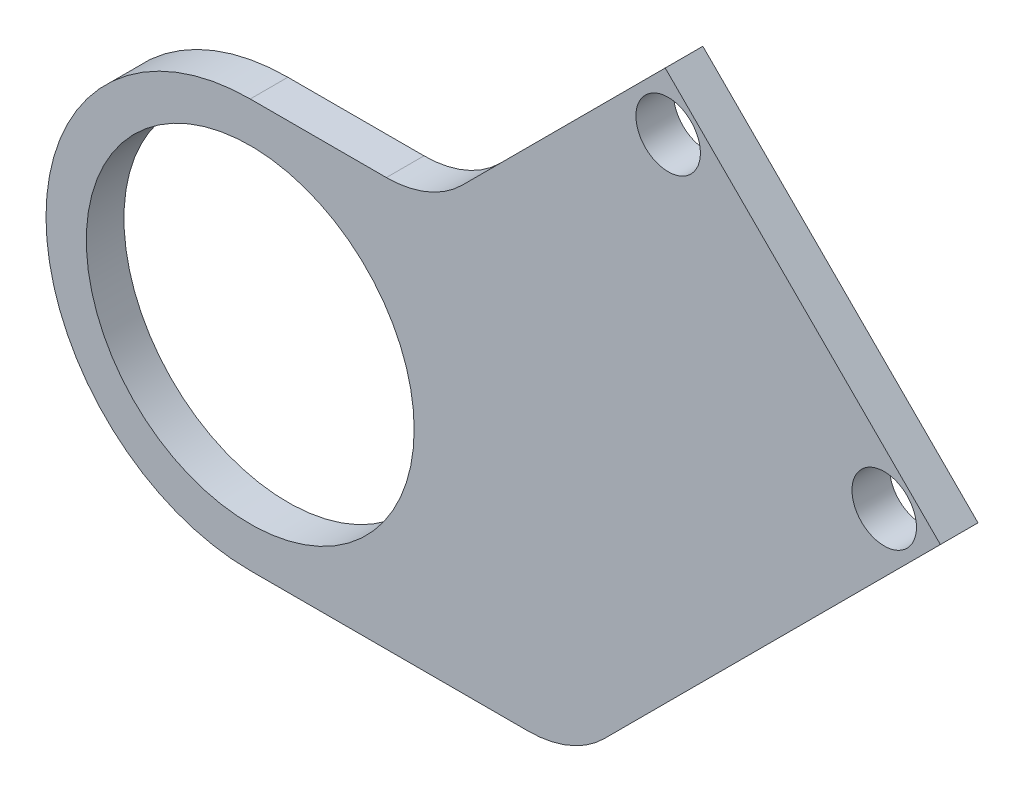
ISO-10303-21;
HEADER;
FILE_DESCRIPTION(('STEP AP214'),'2;1');
FILE_NAME('part.step','',(''),(''),'','','');
FILE_SCHEMA(('AUTOMOTIVE_DESIGN { 1 0 10303 214 1 1 1 1 }'));
ENDSEC;
DATA;
#1=APPLICATION_CONTEXT('core data for automotive mechanical design processes');
#2=APPLICATION_PROTOCOL_DEFINITION('international standard','automotive_design',2000,#1);
#3=PRODUCT_CONTEXT('',#1,'mechanical');
#4=PRODUCT('Part','Part','',(#3));
#5=PRODUCT_RELATED_PRODUCT_CATEGORY('part','',(#4));
#6=PRODUCT_DEFINITION_FORMATION('','',#4);
#7=PRODUCT_DEFINITION_CONTEXT('part definition',#1,'design');
#8=PRODUCT_DEFINITION('design','',#6,#7);
#9=PRODUCT_DEFINITION_SHAPE('','',#8);
#10=(LENGTH_UNIT() NAMED_UNIT(*) SI_UNIT(.MILLI.,.METRE.));
#11=(NAMED_UNIT(*) PLANE_ANGLE_UNIT() SI_UNIT($,.RADIAN.));
#12=(NAMED_UNIT(*) SI_UNIT($,.STERADIAN.) SOLID_ANGLE_UNIT());
#13=UNCERTAINTY_MEASURE_WITH_UNIT(LENGTH_MEASURE(1.E-05),#10,'distance_accuracy_value','');
#14=(GEOMETRIC_REPRESENTATION_CONTEXT(3) GLOBAL_UNCERTAINTY_ASSIGNED_CONTEXT((#13)) GLOBAL_UNIT_ASSIGNED_CONTEXT((#10,
#11,#12)) REPRESENTATION_CONTEXT('',''));
#15=CARTESIAN_POINT('',(0.,0.,0.));
#16=DIRECTION('',(0.,0.,1.));
#17=DIRECTION('',(1.,0.,0.));
#18=AXIS2_PLACEMENT_3D('',#15,#16,#17);
#19=CARTESIAN_POINT('',(0.,0.,3.5));
#20=DIRECTION('',(0.,0.,1.));
#21=DIRECTION('',(1.,0.,0.));
#22=AXIS2_PLACEMENT_3D('',#19,#20,#21);
#23=PLANE('',#22);
#24=CARTESIAN_POINT('',(58.9776159145075,15.4753711382333,3.5));
#25=DIRECTION('',(0.,0.,1.));
#26=DIRECTION('',(1.,0.,0.));
#27=AXIS2_PLACEMENT_3D('',#24,#25,#26);
#28=CIRCLE('',#27,3.);
#29=CARTESIAN_POINT('',(61.9776159145075,15.4753711382333,3.5));
#30=VERTEX_POINT('',#29);
#31=EDGE_CURVE('E192',#30,#30,#28,.T.);
#32=ORIENTED_EDGE('',*,*,#31,.F.);
#33=EDGE_LOOP('',(#32));
#34=FACE_BOUND('',#33,.T.);
#35=CARTESIAN_POINT('',(38.8781056592798,35.5748813934608,3.5));
#36=DIRECTION('',(0.,0.,1.));
#37=DIRECTION('',(1.,0.,0.));
#38=AXIS2_PLACEMENT_3D('',#35,#36,#37);
#39=CIRCLE('',#38,3.);
#40=CARTESIAN_POINT('',(41.8781056592798,35.5748813934608,3.5));
#41=VERTEX_POINT('',#40);
#42=EDGE_CURVE('E186',#41,#41,#39,.T.);
#43=ORIENTED_EDGE('',*,*,#42,.F.);
#44=EDGE_LOOP('',(#43));
#45=FACE_BOUND('',#44,.T.);
#46=CARTESIAN_POINT('',(0.,0.,3.5));
#47=DIRECTION('',(0.,0.,1.));
#48=DIRECTION('',(1.,0.,0.));
#49=AXIS2_PLACEMENT_3D('',#46,#47,#48);
#50=CIRCLE('',#49,15.25);
#51=CARTESIAN_POINT('',(15.25,0.,3.5));
#52=VERTEX_POINT('',#51);
#53=EDGE_CURVE('E180',#52,#52,#50,.T.);
#54=ORIENTED_EDGE('',*,*,#53,.F.);
#55=EDGE_LOOP('',(#54));
#56=FACE_BOUND('',#55,.T.);
#57=DIRECTION('',(1.,0.,0.));
#58=VECTOR('',#57,1.);
#59=CARTESIAN_POINT('',(0.,-19.,3.5));
#60=LINE('',#59,#58);
#61=CARTESIAN_POINT('',(0.,-19.,3.5));
#62=VERTEX_POINT('',#61);
#63=CARTESIAN_POINT('',(25.8578643762693,-19.0000000000005,3.5));
#64=VERTEX_POINT('',#63);
#65=EDGE_CURVE('E95',#62,#64,#60,.T.);
#66=ORIENTED_EDGE('',*,*,#65,.T.);
#67=CARTESIAN_POINT('',(25.8578643762695,-9.00000000000045,3.5));
#68=DIRECTION('',(0.,0.,1.));
#69=DIRECTION('',(1.,0.,0.));
#70=AXIS2_PLACEMENT_3D('',#67,#68,#69);
#71=CIRCLE('',#70,10.);
#72=CARTESIAN_POINT('',(32.9289321881352,-16.0710678118658,3.5));
#73=VERTEX_POINT('',#72);
#74=EDGE_CURVE('E134',#64,#73,#71,.T.);
#75=ORIENTED_EDGE('',*,*,#74,.T.);
#76=DIRECTION('',(0.707106781186533,0.707106781186562,0.));
#77=VECTOR('',#76,1.);
#78=CARTESIAN_POINT('',(30.0000000000005,-19.0000000000005,3.5));
#79=LINE('',#78,#77);
#80=CARTESIAN_POINT('',(64.2013672605232,15.2013672605235,3.5));
#81=VERTEX_POINT('',#80);
#82=EDGE_CURVE('E103',#73,#81,#79,.T.);
#83=ORIENTED_EDGE('',*,*,#82,.T.);
#84=DIRECTION('',(-0.707106781186553,0.707106781186542,0.));
#85=VECTOR('',#84,1.);
#86=CARTESIAN_POINT('',(64.2013672605232,15.2013672605235,3.5));
#87=LINE('',#86,#85);
#88=CARTESIAN_POINT('',(38.60410178157,40.7986327394764,3.5));
#89=VERTEX_POINT('',#88);
#90=EDGE_CURVE('E160',#81,#89,#87,.T.);
#91=ORIENTED_EDGE('',*,*,#90,.T.);
#92=DIRECTION('',(-0.707106781186561,-0.707106781186534,0.));
#93=VECTOR('',#92,1.);
#94=CARTESIAN_POINT('',(38.60410178157,40.7986327394764,3.5));
#95=LINE('',#94,#93);
#96=CARTESIAN_POINT('',(19.7344012302273,21.9289321881344,3.5));
#97=VERTEX_POINT('',#96);
#98=EDGE_CURVE('E154',#89,#97,#95,.T.);
#99=ORIENTED_EDGE('',*,*,#98,.T.);
#100=CARTESIAN_POINT('',(12.6633334183619,29.,3.5));
#101=DIRECTION('',(0.,0.,1.));
#102=DIRECTION('',(1.,0.,0.));
#103=AXIS2_PLACEMENT_3D('',#100,#101,#102);
#104=CIRCLE('',#103,10.);
#105=CARTESIAN_POINT('',(12.6633334183619,19.,3.5));
#106=VERTEX_POINT('',#105);
#107=EDGE_CURVE('E11',#97,#106,#104,.F.);
#108=ORIENTED_EDGE('',*,*,#107,.T.);
#109=DIRECTION('',(-1.,0.,0.));
#110=VECTOR('',#109,1.);
#111=CARTESIAN_POINT('',(16.8054690420928,19.,3.5));
#112=LINE('',#111,#110);
#113=CARTESIAN_POINT('',(0.,19.,3.5));
#114=VERTEX_POINT('',#113);
#115=EDGE_CURVE('E108',#106,#114,#112,.T.);
#116=ORIENTED_EDGE('',*,*,#115,.T.);
#117=CARTESIAN_POINT('',(0.,0.,3.5));
#118=DIRECTION('',(0.,0.,1.));
#119=DIRECTION('',(1.,0.,0.));
#120=AXIS2_PLACEMENT_3D('',#117,#118,#119);
#121=CIRCLE('',#120,19.);
#122=EDGE_CURVE('E104',#114,#62,#121,.T.);
#123=ORIENTED_EDGE('',*,*,#122,.T.);
#124=EDGE_LOOP('',(#66,#75,#83,#91,#99,#108,#116,#123));
#125=FACE_BOUND('',#124,.T.);
#126=ADVANCED_FACE('F33',(#34,#45,#56,#125),#23,.T.);
#127=CARTESIAN_POINT('',(0.,0.,0.));
#128=DIRECTION('',(0.,0.,1.));
#129=DIRECTION('',(1.,0.,0.));
#130=AXIS2_PLACEMENT_3D('',#127,#128,#129);
#131=PLANE('',#130);
#132=CARTESIAN_POINT('',(58.9776159145075,15.4753711382333,0.));
#133=DIRECTION('',(0.,0.,1.));
#134=DIRECTION('',(1.,0.,0.));
#135=AXIS2_PLACEMENT_3D('',#132,#133,#134);
#136=CIRCLE('',#135,3.);
#137=CARTESIAN_POINT('',(61.9776159145075,15.4753711382333,0.));
#138=VERTEX_POINT('',#137);
#139=EDGE_CURVE('E189',#138,#138,#136,.T.);
#140=ORIENTED_EDGE('',*,*,#139,.T.);
#141=EDGE_LOOP('',(#140));
#142=FACE_BOUND('',#141,.T.);
#143=CARTESIAN_POINT('',(38.8781056592798,35.5748813934608,0.));
#144=DIRECTION('',(0.,0.,1.));
#145=DIRECTION('',(1.,0.,0.));
#146=AXIS2_PLACEMENT_3D('',#143,#144,#145);
#147=CIRCLE('',#146,3.);
#148=CARTESIAN_POINT('',(41.8781056592798,35.5748813934608,0.));
#149=VERTEX_POINT('',#148);
#150=EDGE_CURVE('E183',#149,#149,#147,.T.);
#151=ORIENTED_EDGE('',*,*,#150,.T.);
#152=EDGE_LOOP('',(#151));
#153=FACE_BOUND('',#152,.T.);
#154=CARTESIAN_POINT('',(0.,0.,0.));
#155=DIRECTION('',(0.,0.,1.));
#156=DIRECTION('',(1.,0.,0.));
#157=AXIS2_PLACEMENT_3D('',#154,#155,#156);
#158=CIRCLE('',#157,15.25);
#159=CARTESIAN_POINT('',(15.25,0.,0.));
#160=VERTEX_POINT('',#159);
#161=EDGE_CURVE('E166',#160,#160,#158,.T.);
#162=ORIENTED_EDGE('',*,*,#161,.T.);
#163=EDGE_LOOP('',(#162));
#164=FACE_BOUND('',#163,.T.);
#165=DIRECTION('',(0.707106781186533,0.707106781186562,0.));
#166=VECTOR('',#165,1.);
#167=CARTESIAN_POINT('',(30.0000000000005,-19.0000000000005,0.));
#168=LINE('',#167,#166);
#169=CARTESIAN_POINT('',(32.9289321881352,-16.0710678118658,0.));
#170=VERTEX_POINT('',#169);
#171=CARTESIAN_POINT('',(64.2013672605232,15.2013672605235,0.));
#172=VERTEX_POINT('',#171);
#173=EDGE_CURVE('E168',#170,#172,#168,.T.);
#174=ORIENTED_EDGE('',*,*,#173,.F.);
#175=CARTESIAN_POINT('',(25.8578643762695,-9.00000000000045,0.));
#176=DIRECTION('',(0.,0.,1.));
#177=DIRECTION('',(1.,0.,0.));
#178=AXIS2_PLACEMENT_3D('',#175,#176,#177);
#179=CIRCLE('',#178,10.);
#180=CARTESIAN_POINT('',(25.8578643762693,-19.0000000000005,0.));
#181=VERTEX_POINT('',#180);
#182=EDGE_CURVE('E56',#170,#181,#179,.F.);
#183=ORIENTED_EDGE('',*,*,#182,.T.);
#184=DIRECTION('',(1.,0.,0.));
#185=VECTOR('',#184,1.);
#186=CARTESIAN_POINT('',(0.,-19.,0.));
#187=LINE('',#186,#185);
#188=CARTESIAN_POINT('',(0.,-19.,0.));
#189=VERTEX_POINT('',#188);
#190=EDGE_CURVE('E165',#189,#181,#187,.T.);
#191=ORIENTED_EDGE('',*,*,#190,.F.);
#192=CARTESIAN_POINT('',(0.,0.,0.));
#193=DIRECTION('',(0.,0.,1.));
#194=DIRECTION('',(1.,0.,0.));
#195=AXIS2_PLACEMENT_3D('',#192,#193,#194);
#196=CIRCLE('',#195,19.);
#197=CARTESIAN_POINT('',(0.,19.,0.));
#198=VERTEX_POINT('',#197);
#199=EDGE_CURVE('E116',#198,#189,#196,.T.);
#200=ORIENTED_EDGE('',*,*,#199,.F.);
#201=DIRECTION('',(-1.,0.,0.));
#202=VECTOR('',#201,1.);
#203=CARTESIAN_POINT('',(16.8054690420928,19.,0.));
#204=LINE('',#203,#202);
#205=CARTESIAN_POINT('',(12.6633334183619,19.,0.));
#206=VERTEX_POINT('',#205);
#207=EDGE_CURVE('E112',#206,#198,#204,.T.);
#208=ORIENTED_EDGE('',*,*,#207,.F.);
#209=CARTESIAN_POINT('',(12.6633334183619,29.,0.));
#210=DIRECTION('',(0.,0.,1.));
#211=DIRECTION('',(1.,0.,0.));
#212=AXIS2_PLACEMENT_3D('',#209,#210,#211);
#213=CIRCLE('',#212,10.);
#214=CARTESIAN_POINT('',(19.7344012302273,21.9289321881344,0.));
#215=VERTEX_POINT('',#214);
#216=EDGE_CURVE('E41',#206,#215,#213,.T.);
#217=ORIENTED_EDGE('',*,*,#216,.T.);
#218=DIRECTION('',(-0.707106781186561,-0.707106781186534,0.));
#219=VECTOR('',#218,1.);
#220=CARTESIAN_POINT('',(38.60410178157,40.7986327394764,0.));
#221=LINE('',#220,#219);
#222=CARTESIAN_POINT('',(38.60410178157,40.7986327394764,0.));
#223=VERTEX_POINT('',#222);
#224=EDGE_CURVE('E140',#223,#215,#221,.T.);
#225=ORIENTED_EDGE('',*,*,#224,.F.);
#226=DIRECTION('',(-0.70710678118655,0.707106781186545,0.));
#227=VECTOR('',#226,1.);
#228=CARTESIAN_POINT('',(44.1902453529437,35.2124891681027,0.));
#229=LINE('',#228,#227);
#230=EDGE_CURVE('E150',#172,#223,#229,.T.);
#231=ORIENTED_EDGE('',*,*,#230,.F.);
#232=EDGE_LOOP('',(#174,#183,#191,#200,#208,#217,#225,#231));
#233=FACE_BOUND('',#232,.T.);
#234=ADVANCED_FACE('F138',(#142,#153,#164,#233),#131,.F.);
#235=CARTESIAN_POINT('',(0.,0.,3.5));
#236=DIRECTION('',(0.,0.,-1.));
#237=DIRECTION('',(-1.,0.,0.));
#238=AXIS2_PLACEMENT_3D('',#235,#236,#237);
#239=CYLINDRICAL_SURFACE('',#238,19.);
#240=ORIENTED_EDGE('',*,*,#199,.T.);
#241=DIRECTION('',(0.,0.,-1.));
#242=VECTOR('',#241,1.);
#243=CARTESIAN_POINT('',(0.,-19.,3.5));
#244=LINE('',#243,#242);
#245=EDGE_CURVE('E99',#62,#189,#244,.T.);
#246=ORIENTED_EDGE('',*,*,#245,.F.);
#247=ORIENTED_EDGE('',*,*,#122,.F.);
#248=DIRECTION('',(0.,0.,-1.));
#249=VECTOR('',#248,1.);
#250=CARTESIAN_POINT('',(0.,19.,3.5));
#251=LINE('',#250,#249);
#252=EDGE_CURVE('E157',#114,#198,#251,.T.);
#253=ORIENTED_EDGE('',*,*,#252,.T.);
#254=EDGE_LOOP('',(#240,#246,#247,#253));
#255=FACE_BOUND('',#254,.T.);
#256=ADVANCED_FACE('F114',(#255),#239,.T.);
#257=CARTESIAN_POINT('',(0.,-19.,3.5));
#258=DIRECTION('',(0.,1.,0.));
#259=DIRECTION('',(-1.,0.,0.));
#260=AXIS2_PLACEMENT_3D('',#257,#258,#259);
#261=PLANE('',#260);
#262=ORIENTED_EDGE('',*,*,#190,.T.);
#263=DIRECTION('',(0.,0.,-1.));
#264=VECTOR('',#263,1.);
#265=CARTESIAN_POINT('',(25.8578643762693,-19.0000000000005,3.5));
#266=LINE('',#265,#264);
#267=EDGE_CURVE('E48',#181,#64,#266,.F.);
#268=ORIENTED_EDGE('',*,*,#267,.T.);
#269=ORIENTED_EDGE('',*,*,#65,.F.);
#270=ORIENTED_EDGE('',*,*,#245,.T.);
#271=EDGE_LOOP('',(#262,#268,#269,#270));
#272=FACE_BOUND('',#271,.T.);
#273=ADVANCED_FACE('F97',(#272),#261,.F.);
#274=CARTESIAN_POINT('',(30.0000000000005,-19.0000000000005,3.5));
#275=DIRECTION('',(-0.707106781186563,0.707106781186533,0.));
#276=DIRECTION('',(-0.707106781186533,-0.707106781186562,0.));
#277=AXIS2_PLACEMENT_3D('',#274,#275,#276);
#278=PLANE('',#277);
#279=ORIENTED_EDGE('',*,*,#82,.F.);
#280=DIRECTION('',(0.,0.,-1.));
#281=VECTOR('',#280,1.);
#282=CARTESIAN_POINT('',(32.9289321881352,-16.0710678118658,3.5));
#283=LINE('',#282,#281);
#284=EDGE_CURVE('E129',#73,#170,#283,.T.);
#285=ORIENTED_EDGE('',*,*,#284,.T.);
#286=ORIENTED_EDGE('',*,*,#173,.T.);
#287=DIRECTION('',(0.,0.,-1.));
#288=VECTOR('',#287,1.);
#289=CARTESIAN_POINT('',(64.2013672605232,15.2013672605235,3.5));
#290=LINE('',#289,#288);
#291=EDGE_CURVE('E118',#81,#172,#290,.T.);
#292=ORIENTED_EDGE('',*,*,#291,.F.);
#293=EDGE_LOOP('',(#279,#285,#286,#292));
#294=FACE_BOUND('',#293,.T.);
#295=ADVANCED_FACE('F176',(#294),#278,.F.);
#296=CARTESIAN_POINT('',(44.1902453529437,35.2124891681027,3.5));
#297=DIRECTION('',(-0.707106781186545,-0.70710678118655,0.));
#298=DIRECTION('',(0.70710678118655,-0.707106781186545,0.));
#299=AXIS2_PLACEMENT_3D('',#296,#297,#298);
#300=PLANE('',#299);
#301=ORIENTED_EDGE('',*,*,#230,.T.);
#302=DIRECTION('',(0.,0.,-1.));
#303=VECTOR('',#302,1.);
#304=CARTESIAN_POINT('',(38.60410178157,40.7986327394764,3.5));
#305=LINE('',#304,#303);
#306=EDGE_CURVE('E124',#89,#223,#305,.T.);
#307=ORIENTED_EDGE('',*,*,#306,.F.);
#308=ORIENTED_EDGE('',*,*,#90,.F.);
#309=ORIENTED_EDGE('',*,*,#291,.T.);
#310=EDGE_LOOP('',(#301,#307,#308,#309));
#311=FACE_BOUND('',#310,.T.);
#312=ADVANCED_FACE('F232',(#311),#300,.F.);
#313=CARTESIAN_POINT('',(38.60410178157,40.7986327394764,3.5));
#314=DIRECTION('',(0.707106781186534,-0.707106781186561,0.));
#315=DIRECTION('',(0.707106781186561,0.707106781186534,0.));
#316=AXIS2_PLACEMENT_3D('',#313,#314,#315);
#317=PLANE('',#316);
#318=ORIENTED_EDGE('',*,*,#224,.T.);
#319=DIRECTION('',(0.,0.,-1.));
#320=VECTOR('',#319,1.);
#321=CARTESIAN_POINT('',(19.7344012302273,21.9289321881344,3.5));
#322=LINE('',#321,#320);
#323=EDGE_CURVE('E121',#215,#97,#322,.F.);
#324=ORIENTED_EDGE('',*,*,#323,.T.);
#325=ORIENTED_EDGE('',*,*,#98,.F.);
#326=ORIENTED_EDGE('',*,*,#306,.T.);
#327=EDGE_LOOP('',(#318,#324,#325,#326));
#328=FACE_BOUND('',#327,.T.);
#329=ADVANCED_FACE('F146',(#328),#317,.F.);
#330=CARTESIAN_POINT('',(16.8054690420928,19.,3.5));
#331=DIRECTION('',(0.,-1.,0.));
#332=DIRECTION('',(0.,0.,-1.));
#333=AXIS2_PLACEMENT_3D('',#330,#331,#332);
#334=PLANE('',#333);
#335=ORIENTED_EDGE('',*,*,#115,.F.);
#336=DIRECTION('',(0.,0.,-1.));
#337=VECTOR('',#336,1.);
#338=CARTESIAN_POINT('',(12.6633334183619,19.,0.));
#339=LINE('',#338,#337);
#340=EDGE_CURVE('E117',#106,#206,#339,.T.);
#341=ORIENTED_EDGE('',*,*,#340,.T.);
#342=ORIENTED_EDGE('',*,*,#207,.T.);
#343=ORIENTED_EDGE('',*,*,#252,.F.);
#344=EDGE_LOOP('',(#335,#341,#342,#343));
#345=FACE_BOUND('',#344,.T.);
#346=ADVANCED_FACE('F156',(#345),#334,.F.);
#347=CARTESIAN_POINT('',(12.6633334183619,29.,3.5));
#348=DIRECTION('',(0.,0.,1.));
#349=DIRECTION('',(1.,0.,0.));
#350=AXIS2_PLACEMENT_3D('',#347,#348,#349);
#351=CYLINDRICAL_SURFACE('',#350,10.);
#352=ORIENTED_EDGE('',*,*,#107,.F.);
#353=ORIENTED_EDGE('',*,*,#323,.F.);
#354=ORIENTED_EDGE('',*,*,#216,.F.);
#355=ORIENTED_EDGE('',*,*,#340,.F.);
#356=EDGE_LOOP('',(#352,#353,#354,#355));
#357=FACE_BOUND('',#356,.T.);
#358=ADVANCED_FACE('F153',(#357),#351,.F.);
#359=CARTESIAN_POINT('',(25.8578643762695,-9.00000000000045,3.5));
#360=DIRECTION('',(0.,0.,-1.));
#361=DIRECTION('',(-1.,0.,0.));
#362=AXIS2_PLACEMENT_3D('',#359,#360,#361);
#363=CYLINDRICAL_SURFACE('',#362,10.);
#364=ORIENTED_EDGE('',*,*,#74,.F.);
#365=ORIENTED_EDGE('',*,*,#267,.F.);
#366=ORIENTED_EDGE('',*,*,#182,.F.);
#367=ORIENTED_EDGE('',*,*,#284,.F.);
#368=EDGE_LOOP('',(#364,#365,#366,#367));
#369=FACE_BOUND('',#368,.T.);
#370=ADVANCED_FACE('F35',(#369),#363,.T.);
#371=CARTESIAN_POINT('',(0.,0.,0.));
#372=DIRECTION('',(0.,0.,1.));
#373=DIRECTION('',(1.,0.,0.));
#374=AXIS2_PLACEMENT_3D('',#371,#372,#373);
#375=CYLINDRICAL_SURFACE('',#374,15.25);
#376=ORIENTED_EDGE('',*,*,#161,.F.);
#377=EDGE_LOOP('',(#376));
#378=FACE_BOUND('',#377,.T.);
#379=ORIENTED_EDGE('',*,*,#53,.T.);
#380=EDGE_LOOP('',(#379));
#381=FACE_BOUND('',#380,.T.);
#382=ADVANCED_FACE('F214',(#378,#381),#375,.F.);
#383=CARTESIAN_POINT('',(38.8781056592798,35.5748813934608,0.));
#384=DIRECTION('',(0.,0.,1.));
#385=DIRECTION('',(1.,0.,0.));
#386=AXIS2_PLACEMENT_3D('',#383,#384,#385);
#387=CYLINDRICAL_SURFACE('',#386,3.);
#388=ORIENTED_EDGE('',*,*,#150,.F.);
#389=EDGE_LOOP('',(#388));
#390=FACE_BOUND('',#389,.T.);
#391=ORIENTED_EDGE('',*,*,#42,.T.);
#392=EDGE_LOOP('',(#391));
#393=FACE_BOUND('',#392,.T.);
#394=ADVANCED_FACE('F203',(#390,#393),#387,.F.);
#395=CARTESIAN_POINT('',(58.9776159145075,15.4753711382333,0.));
#396=DIRECTION('',(0.,0.,1.));
#397=DIRECTION('',(1.,0.,0.));
#398=AXIS2_PLACEMENT_3D('',#395,#396,#397);
#399=CYLINDRICAL_SURFACE('',#398,3.);
#400=ORIENTED_EDGE('',*,*,#139,.F.);
#401=EDGE_LOOP('',(#400));
#402=FACE_BOUND('',#401,.T.);
#403=ORIENTED_EDGE('',*,*,#31,.T.);
#404=EDGE_LOOP('',(#403));
#405=FACE_BOUND('',#404,.T.);
#406=ADVANCED_FACE('F200',(#402,#405),#399,.F.);
#407=CLOSED_SHELL('',(#126,#234,#256,#273,#295,#312,#329,#346,#358,#370,#382,#394,#406));
#408=MANIFOLD_SOLID_BREP('B2',#407);
#409=ADVANCED_BREP_SHAPE_REPRESENTATION('',(#18,#408),#14);
#410=SHAPE_DEFINITION_REPRESENTATION(#9,#409);
ENDSEC;
END-ISO-10303-21;
